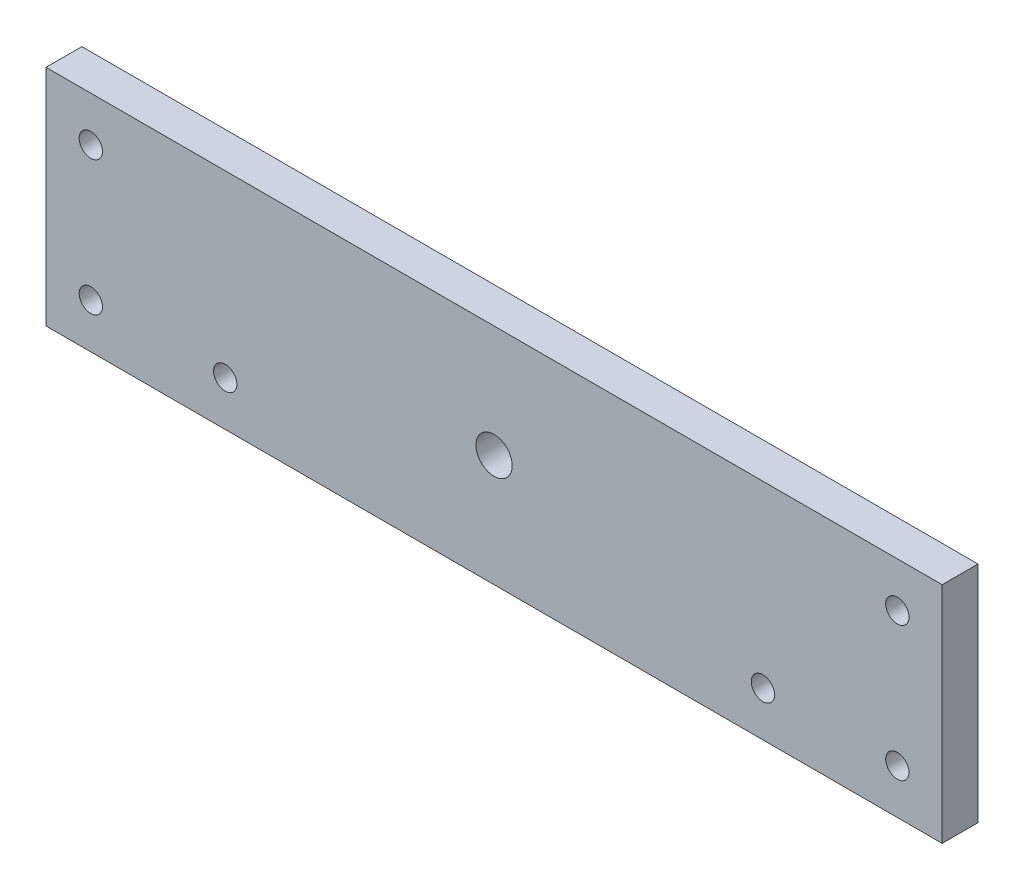
ISO-10303-21;
HEADER;
FILE_DESCRIPTION(('STEP AP214'),'2;1');
FILE_NAME('part.step','',(''),(''),'','','');
FILE_SCHEMA(('AUTOMOTIVE_DESIGN { 1 0 10303 214 1 1 1 1 }'));
ENDSEC;
DATA;
#1=APPLICATION_CONTEXT('core data for automotive mechanical design processes');
#2=APPLICATION_PROTOCOL_DEFINITION('international standard','automotive_design',2000,#1);
#3=PRODUCT_CONTEXT('',#1,'mechanical');
#4=PRODUCT('Part','Part','',(#3));
#5=PRODUCT_RELATED_PRODUCT_CATEGORY('part','',(#4));
#6=PRODUCT_DEFINITION_FORMATION('','',#4);
#7=PRODUCT_DEFINITION_CONTEXT('part definition',#1,'design');
#8=PRODUCT_DEFINITION('design','',#6,#7);
#9=PRODUCT_DEFINITION_SHAPE('','',#8);
#10=(LENGTH_UNIT() NAMED_UNIT(*) SI_UNIT(.MILLI.,.METRE.));
#11=(NAMED_UNIT(*) PLANE_ANGLE_UNIT() SI_UNIT($,.RADIAN.));
#12=(NAMED_UNIT(*) SI_UNIT($,.STERADIAN.) SOLID_ANGLE_UNIT());
#13=UNCERTAINTY_MEASURE_WITH_UNIT(LENGTH_MEASURE(1.E-05),#10,'distance_accuracy_value','');
#14=(GEOMETRIC_REPRESENTATION_CONTEXT(3) GLOBAL_UNCERTAINTY_ASSIGNED_CONTEXT((#13)) GLOBAL_UNIT_ASSIGNED_CONTEXT((#10,
#11,#12)) REPRESENTATION_CONTEXT('',''));
#15=CARTESIAN_POINT('',(0.,0.,0.));
#16=DIRECTION('',(0.,0.,1.));
#17=DIRECTION('',(1.,0.,0.));
#18=AXIS2_PLACEMENT_3D('',#15,#16,#17);
#19=CARTESIAN_POINT('',(-88.1445904954499,-0.815217391304357,8.));
#20=DIRECTION('',(0.,1.,0.));
#21=DIRECTION('',(0.,0.,1.));
#22=AXIS2_PLACEMENT_3D('',#19,#20,#21);
#23=PLANE('',#22);
#24=DIRECTION('',(1.,0.,0.));
#25=VECTOR('',#24,1.);
#26=CARTESIAN_POINT('',(-88.1445904954499,-0.815217391304357,0.));
#27=LINE('',#26,#25);
#28=CARTESIAN_POINT('',(-88.1445904954499,-0.815217391304357,0.));
#29=VERTEX_POINT('',#28);
#30=CARTESIAN_POINT('',(111.85540950455,-0.815217391304357,0.));
#31=VERTEX_POINT('',#30);
#32=EDGE_CURVE('E105',#29,#31,#27,.T.);
#33=ORIENTED_EDGE('',*,*,#32,.T.);
#34=DIRECTION('',(0.,0.,-1.));
#35=VECTOR('',#34,1.);
#36=CARTESIAN_POINT('',(111.85540950455,-0.815217391304357,8.));
#37=LINE('',#36,#35);
#38=CARTESIAN_POINT('',(111.85540950455,-0.815217391304357,8.));
#39=VERTEX_POINT('',#38);
#40=EDGE_CURVE('E11',#39,#31,#37,.T.);
#41=ORIENTED_EDGE('',*,*,#40,.F.);
#42=DIRECTION('',(1.,0.,0.));
#43=VECTOR('',#42,1.);
#44=CARTESIAN_POINT('',(-88.1445904954499,-0.815217391304357,8.));
#45=LINE('',#44,#43);
#46=CARTESIAN_POINT('',(-88.1445904954499,-0.815217391304357,8.));
#47=VERTEX_POINT('',#46);
#48=EDGE_CURVE('E78',#47,#39,#45,.T.);
#49=ORIENTED_EDGE('',*,*,#48,.F.);
#50=DIRECTION('',(0.,0.,-1.));
#51=VECTOR('',#50,1.);
#52=CARTESIAN_POINT('',(-88.1445904954499,-0.815217391304357,8.));
#53=LINE('',#52,#51);
#54=EDGE_CURVE('E101',#47,#29,#53,.T.);
#55=ORIENTED_EDGE('',*,*,#54,.T.);
#56=EDGE_LOOP('',(#33,#41,#49,#55));
#57=FACE_BOUND('',#56,.T.);
#58=ADVANCED_FACE('F38',(#57),#23,.F.);
#59=CARTESIAN_POINT('',(111.85540950455,49.1847826086956,8.));
#60=DIRECTION('',(1.,0.,0.));
#61=DIRECTION('',(0.,1.,0.));
#62=AXIS2_PLACEMENT_3D('',#59,#60,#61);
#63=PLANE('',#62);
#64=DIRECTION('',(0.,-1.,0.));
#65=VECTOR('',#64,1.);
#66=CARTESIAN_POINT('',(111.85540950455,49.1847826086956,0.));
#67=LINE('',#66,#65);
#68=CARTESIAN_POINT('',(111.85540950455,49.1847826086956,0.));
#69=VERTEX_POINT('',#68);
#70=EDGE_CURVE('E87',#69,#31,#67,.T.);
#71=ORIENTED_EDGE('',*,*,#70,.F.);
#72=DIRECTION('',(0.,0.,-1.));
#73=VECTOR('',#72,1.);
#74=CARTESIAN_POINT('',(111.85540950455,49.1847826086956,8.));
#75=LINE('',#74,#73);
#76=CARTESIAN_POINT('',(111.85540950455,49.1847826086956,8.));
#77=VERTEX_POINT('',#76);
#78=EDGE_CURVE('E47',#77,#69,#75,.T.);
#79=ORIENTED_EDGE('',*,*,#78,.F.);
#80=DIRECTION('',(0.,-1.,0.));
#81=VECTOR('',#80,1.);
#82=CARTESIAN_POINT('',(111.85540950455,49.1847826086956,8.));
#83=LINE('',#82,#81);
#84=EDGE_CURVE('E85',#77,#39,#83,.T.);
#85=ORIENTED_EDGE('',*,*,#84,.T.);
#86=ORIENTED_EDGE('',*,*,#40,.T.);
#87=EDGE_LOOP('',(#71,#79,#85,#86));
#88=FACE_BOUND('',#87,.T.);
#89=ADVANCED_FACE('F84',(#88),#63,.T.);
#90=CARTESIAN_POINT('',(-88.1445904954499,49.1847826086956,8.));
#91=DIRECTION('',(0.,1.,0.));
#92=DIRECTION('',(0.,0.,1.));
#93=AXIS2_PLACEMENT_3D('',#90,#91,#92);
#94=PLANE('',#93);
#95=DIRECTION('',(1.,0.,0.));
#96=VECTOR('',#95,1.);
#97=CARTESIAN_POINT('',(-88.1445904954499,49.1847826086956,0.));
#98=LINE('',#97,#96);
#99=CARTESIAN_POINT('',(-88.1445904954499,49.1847826086956,0.));
#100=VERTEX_POINT('',#99);
#101=EDGE_CURVE('E112',#100,#69,#98,.T.);
#102=ORIENTED_EDGE('',*,*,#101,.F.);
#103=DIRECTION('',(0.,0.,-1.));
#104=VECTOR('',#103,1.);
#105=CARTESIAN_POINT('',(-88.1445904954499,49.1847826086956,8.));
#106=LINE('',#105,#104);
#107=CARTESIAN_POINT('',(-88.1445904954499,49.1847826086956,8.));
#108=VERTEX_POINT('',#107);
#109=EDGE_CURVE('E70',#108,#100,#106,.T.);
#110=ORIENTED_EDGE('',*,*,#109,.F.);
#111=DIRECTION('',(1.,0.,0.));
#112=VECTOR('',#111,1.);
#113=CARTESIAN_POINT('',(-88.1445904954499,49.1847826086956,8.));
#114=LINE('',#113,#112);
#115=EDGE_CURVE('E94',#108,#77,#114,.T.);
#116=ORIENTED_EDGE('',*,*,#115,.T.);
#117=ORIENTED_EDGE('',*,*,#78,.T.);
#118=EDGE_LOOP('',(#102,#110,#116,#117));
#119=FACE_BOUND('',#118,.T.);
#120=ADVANCED_FACE('F97',(#119),#94,.T.);
#121=CARTESIAN_POINT('',(-88.1445904954499,49.1847826086956,8.));
#122=DIRECTION('',(1.,0.,0.));
#123=DIRECTION('',(0.,0.,-1.));
#124=AXIS2_PLACEMENT_3D('',#121,#122,#123);
#125=PLANE('',#124);
#126=DIRECTION('',(0.,-1.,0.));
#127=VECTOR('',#126,1.);
#128=CARTESIAN_POINT('',(-88.1445904954499,49.1847826086956,0.));
#129=LINE('',#128,#127);
#130=EDGE_CURVE('E73',#100,#29,#129,.T.);
#131=ORIENTED_EDGE('',*,*,#130,.T.);
#132=ORIENTED_EDGE('',*,*,#54,.F.);
#133=DIRECTION('',(0.,-1.,0.));
#134=VECTOR('',#133,1.);
#135=CARTESIAN_POINT('',(-88.1445904954499,49.1847826086956,8.));
#136=LINE('',#135,#134);
#137=EDGE_CURVE('E55',#108,#47,#136,.T.);
#138=ORIENTED_EDGE('',*,*,#137,.F.);
#139=ORIENTED_EDGE('',*,*,#109,.T.);
#140=EDGE_LOOP('',(#131,#132,#138,#139));
#141=FACE_BOUND('',#140,.T.);
#142=ADVANCED_FACE('F136',(#141),#125,.F.);
#143=CARTESIAN_POINT('',(0.,0.,8.));
#144=DIRECTION('',(0.,0.,-1.));
#145=DIRECTION('',(-1.,0.,0.));
#146=AXIS2_PLACEMENT_3D('',#143,#144,#145);
#147=PLANE('',#146);
#148=CARTESIAN_POINT('',(11.8554095045501,24.1847826086956,8.));
#149=DIRECTION('',(0.,0.,-1.));
#150=DIRECTION('',(-1.,0.,0.));
#151=AXIS2_PLACEMENT_3D('',#148,#149,#150);
#152=CIRCLE('',#151,4.05);
#153=CARTESIAN_POINT('',(7.80540950455011,24.1847826086956,8.));
#154=VERTEX_POINT('',#153);
#155=EDGE_CURVE('E236',#154,#154,#152,.T.);
#156=ORIENTED_EDGE('',*,*,#155,.T.);
#157=EDGE_LOOP('',(#156));
#158=FACE_BOUND('',#157,.T.);
#159=CARTESIAN_POINT('',(71.8554095045501,9.18478260869565,8.));
#160=DIRECTION('',(0.,0.,-1.));
#161=DIRECTION('',(-1.,0.,0.));
#162=AXIS2_PLACEMENT_3D('',#159,#160,#161);
#163=CIRCLE('',#162,2.6);
#164=CARTESIAN_POINT('',(69.2554095045501,9.18478260869565,8.));
#165=VERTEX_POINT('',#164);
#166=EDGE_CURVE('E243',#165,#165,#163,.T.);
#167=ORIENTED_EDGE('',*,*,#166,.T.);
#168=EDGE_LOOP('',(#167));
#169=FACE_BOUND('',#168,.T.);
#170=CARTESIAN_POINT('',(-48.1445904954499,9.18478260869565,8.));
#171=DIRECTION('',(0.,0.,-1.));
#172=DIRECTION('',(-1.,0.,0.));
#173=AXIS2_PLACEMENT_3D('',#170,#171,#172);
#174=CIRCLE('',#173,2.59999999999999);
#175=CARTESIAN_POINT('',(-50.7445904954499,9.18478260869565,8.));
#176=VERTEX_POINT('',#175);
#177=EDGE_CURVE('E254',#176,#176,#174,.T.);
#178=ORIENTED_EDGE('',*,*,#177,.T.);
#179=EDGE_LOOP('',(#178));
#180=FACE_BOUND('',#179,.T.);
#181=CARTESIAN_POINT('',(101.85540950455,39.1847826086956,8.));
#182=DIRECTION('',(0.,0.,-1.));
#183=DIRECTION('',(-1.,0.,0.));
#184=AXIS2_PLACEMENT_3D('',#181,#182,#183);
#185=CIRCLE('',#184,2.6);
#186=CARTESIAN_POINT('',(99.2554095045501,39.1847826086956,8.));
#187=VERTEX_POINT('',#186);
#188=EDGE_CURVE('E262',#187,#187,#185,.T.);
#189=ORIENTED_EDGE('',*,*,#188,.T.);
#190=EDGE_LOOP('',(#189));
#191=FACE_BOUND('',#190,.T.);
#192=CARTESIAN_POINT('',(101.85540950455,9.18478260869565,8.));
#193=DIRECTION('',(0.,0.,-1.));
#194=DIRECTION('',(-1.,0.,0.));
#195=AXIS2_PLACEMENT_3D('',#192,#193,#194);
#196=CIRCLE('',#195,2.6);
#197=CARTESIAN_POINT('',(99.2554095045504,9.18478260869565,8.));
#198=VERTEX_POINT('',#197);
#199=EDGE_CURVE('E270',#198,#198,#196,.T.);
#200=ORIENTED_EDGE('',*,*,#199,.T.);
#201=EDGE_LOOP('',(#200));
#202=FACE_BOUND('',#201,.T.);
#203=CARTESIAN_POINT('',(-78.1445904954496,9.18478260869565,8.));
#204=DIRECTION('',(0.,0.,-1.));
#205=DIRECTION('',(-1.,0.,0.));
#206=AXIS2_PLACEMENT_3D('',#203,#204,#205);
#207=CIRCLE('',#206,2.6);
#208=CARTESIAN_POINT('',(-80.7445904954496,9.18478260869565,8.));
#209=VERTEX_POINT('',#208);
#210=EDGE_CURVE('E278',#209,#209,#207,.T.);
#211=ORIENTED_EDGE('',*,*,#210,.T.);
#212=EDGE_LOOP('',(#211));
#213=FACE_BOUND('',#212,.T.);
#214=CARTESIAN_POINT('',(-78.1445904954499,39.1847826086956,8.));
#215=DIRECTION('',(0.,0.,-1.));
#216=DIRECTION('',(-1.,0.,0.));
#217=AXIS2_PLACEMENT_3D('',#214,#215,#216);
#218=CIRCLE('',#217,2.6);
#219=CARTESIAN_POINT('',(-80.7445904954499,39.1847826086956,8.));
#220=VERTEX_POINT('',#219);
#221=EDGE_CURVE('E109',#220,#220,#218,.T.);
#222=ORIENTED_EDGE('',*,*,#221,.T.);
#223=EDGE_LOOP('',(#222));
#224=FACE_BOUND('',#223,.T.);
#225=ORIENTED_EDGE('',*,*,#48,.T.);
#226=ORIENTED_EDGE('',*,*,#84,.F.);
#227=ORIENTED_EDGE('',*,*,#115,.F.);
#228=ORIENTED_EDGE('',*,*,#137,.T.);
#229=EDGE_LOOP('',(#225,#226,#227,#228));
#230=FACE_BOUND('',#229,.T.);
#231=ADVANCED_FACE('F93',(#158,#169,#180,#191,#202,#213,#224,#230),#147,.F.);
#232=CARTESIAN_POINT('',(0.,0.,0.));
#233=DIRECTION('',(0.,0.,-1.));
#234=DIRECTION('',(-1.,0.,0.));
#235=AXIS2_PLACEMENT_3D('',#232,#233,#234);
#236=PLANE('',#235);
#237=CARTESIAN_POINT('',(11.8554095045501,24.1847826086956,0.));
#238=DIRECTION('',(0.,0.,-1.));
#239=DIRECTION('',(-1.,0.,0.));
#240=AXIS2_PLACEMENT_3D('',#237,#238,#239);
#241=CIRCLE('',#240,4.05);
#242=CARTESIAN_POINT('',(7.80540950455011,24.1847826086956,0.));
#243=VERTEX_POINT('',#242);
#244=EDGE_CURVE('E233',#243,#243,#241,.T.);
#245=ORIENTED_EDGE('',*,*,#244,.F.);
#246=EDGE_LOOP('',(#245));
#247=FACE_BOUND('',#246,.T.);
#248=CARTESIAN_POINT('',(71.8554095045501,9.18478260869565,0.));
#249=DIRECTION('',(0.,0.,-1.));
#250=DIRECTION('',(-1.,0.,0.));
#251=AXIS2_PLACEMENT_3D('',#248,#249,#250);
#252=CIRCLE('',#251,2.59999999999999);
#253=CARTESIAN_POINT('',(69.2554095045501,9.18478260869565,0.));
#254=VERTEX_POINT('',#253);
#255=EDGE_CURVE('E238',#254,#254,#252,.T.);
#256=ORIENTED_EDGE('',*,*,#255,.F.);
#257=EDGE_LOOP('',(#256));
#258=FACE_BOUND('',#257,.T.);
#259=CARTESIAN_POINT('',(-48.1445904954499,9.18478260869565,0.));
#260=DIRECTION('',(0.,0.,-1.));
#261=DIRECTION('',(-1.,0.,0.));
#262=AXIS2_PLACEMENT_3D('',#259,#260,#261);
#263=CIRCLE('',#262,2.59999999999998);
#264=CARTESIAN_POINT('',(-50.7445904954499,9.18478260869565,0.));
#265=VERTEX_POINT('',#264);
#266=EDGE_CURVE('E250',#265,#265,#263,.T.);
#267=ORIENTED_EDGE('',*,*,#266,.F.);
#268=EDGE_LOOP('',(#267));
#269=FACE_BOUND('',#268,.T.);
#270=CARTESIAN_POINT('',(101.85540950455,39.1847826086956,0.));
#271=DIRECTION('',(0.,0.,-1.));
#272=DIRECTION('',(-1.,0.,0.));
#273=AXIS2_PLACEMENT_3D('',#270,#271,#272);
#274=CIRCLE('',#273,2.59999999999999);
#275=CARTESIAN_POINT('',(99.2554095045501,39.1847826086956,0.));
#276=VERTEX_POINT('',#275);
#277=EDGE_CURVE('E258',#276,#276,#274,.T.);
#278=ORIENTED_EDGE('',*,*,#277,.F.);
#279=EDGE_LOOP('',(#278));
#280=FACE_BOUND('',#279,.T.);
#281=CARTESIAN_POINT('',(101.85540950455,9.18478260869565,0.));
#282=DIRECTION('',(0.,0.,-1.));
#283=DIRECTION('',(-1.,0.,0.));
#284=AXIS2_PLACEMENT_3D('',#281,#282,#283);
#285=CIRCLE('',#284,2.59999999999999);
#286=CARTESIAN_POINT('',(99.2554095045504,9.18478260869565,0.));
#287=VERTEX_POINT('',#286);
#288=EDGE_CURVE('E266',#287,#287,#285,.T.);
#289=ORIENTED_EDGE('',*,*,#288,.F.);
#290=EDGE_LOOP('',(#289));
#291=FACE_BOUND('',#290,.T.);
#292=CARTESIAN_POINT('',(-78.1445904954496,9.18478260869565,0.));
#293=DIRECTION('',(0.,0.,-1.));
#294=DIRECTION('',(-1.,0.,0.));
#295=AXIS2_PLACEMENT_3D('',#292,#293,#294);
#296=CIRCLE('',#295,2.59999999999999);
#297=CARTESIAN_POINT('',(-80.7445904954496,9.18478260869565,0.));
#298=VERTEX_POINT('',#297);
#299=EDGE_CURVE('E274',#298,#298,#296,.T.);
#300=ORIENTED_EDGE('',*,*,#299,.F.);
#301=EDGE_LOOP('',(#300));
#302=FACE_BOUND('',#301,.T.);
#303=CARTESIAN_POINT('',(-78.1445904954499,39.1847826086956,0.));
#304=DIRECTION('',(0.,0.,-1.));
#305=DIRECTION('',(-1.,0.,0.));
#306=AXIS2_PLACEMENT_3D('',#303,#304,#305);
#307=CIRCLE('',#306,2.59999999999999);
#308=CARTESIAN_POINT('',(-80.7445904954499,39.1847826086956,0.));
#309=VERTEX_POINT('',#308);
#310=EDGE_CURVE('E282',#309,#309,#307,.T.);
#311=ORIENTED_EDGE('',*,*,#310,.F.);
#312=EDGE_LOOP('',(#311));
#313=FACE_BOUND('',#312,.T.);
#314=ORIENTED_EDGE('',*,*,#32,.F.);
#315=ORIENTED_EDGE('',*,*,#130,.F.);
#316=ORIENTED_EDGE('',*,*,#101,.T.);
#317=ORIENTED_EDGE('',*,*,#70,.T.);
#318=EDGE_LOOP('',(#314,#315,#316,#317));
#319=FACE_BOUND('',#318,.T.);
#320=ADVANCED_FACE('F123',(#247,#258,#269,#280,#291,#302,#313,#319),#236,.T.);
#321=CARTESIAN_POINT('',(-78.1445904954499,39.1847826086956,0.));
#322=DIRECTION('',(0.,0.,-1.));
#323=DIRECTION('',(-1.,0.,0.));
#324=AXIS2_PLACEMENT_3D('',#321,#322,#323);
#325=CYLINDRICAL_SURFACE('',#324,2.6);
#326=ORIENTED_EDGE('',*,*,#221,.F.);
#327=EDGE_LOOP('',(#326));
#328=FACE_BOUND('',#327,.T.);
#329=ORIENTED_EDGE('',*,*,#310,.T.);
#330=EDGE_LOOP('',(#329));
#331=FACE_BOUND('',#330,.T.);
#332=ADVANCED_FACE('F125',(#328,#331),#325,.F.);
#333=CARTESIAN_POINT('',(-78.1445904954496,9.18478260869565,0.));
#334=DIRECTION('',(0.,0.,-1.));
#335=DIRECTION('',(-1.,0.,0.));
#336=AXIS2_PLACEMENT_3D('',#333,#334,#335);
#337=CYLINDRICAL_SURFACE('',#336,2.6);
#338=ORIENTED_EDGE('',*,*,#210,.F.);
#339=EDGE_LOOP('',(#338));
#340=FACE_BOUND('',#339,.T.);
#341=ORIENTED_EDGE('',*,*,#299,.T.);
#342=EDGE_LOOP('',(#341));
#343=FACE_BOUND('',#342,.T.);
#344=ADVANCED_FACE('F133',(#340,#343),#337,.F.);
#345=CARTESIAN_POINT('',(101.85540950455,9.18478260869565,0.));
#346=DIRECTION('',(0.,0.,-1.));
#347=DIRECTION('',(-1.,0.,0.));
#348=AXIS2_PLACEMENT_3D('',#345,#346,#347);
#349=CYLINDRICAL_SURFACE('',#348,2.6);
#350=ORIENTED_EDGE('',*,*,#199,.F.);
#351=EDGE_LOOP('',(#350));
#352=FACE_BOUND('',#351,.T.);
#353=ORIENTED_EDGE('',*,*,#288,.T.);
#354=EDGE_LOOP('',(#353));
#355=FACE_BOUND('',#354,.T.);
#356=ADVANCED_FACE('F176',(#352,#355),#349,.F.);
#357=CARTESIAN_POINT('',(101.85540950455,39.1847826086956,0.));
#358=DIRECTION('',(0.,0.,-1.));
#359=DIRECTION('',(-1.,0.,0.));
#360=AXIS2_PLACEMENT_3D('',#357,#358,#359);
#361=CYLINDRICAL_SURFACE('',#360,2.6);
#362=ORIENTED_EDGE('',*,*,#188,.F.);
#363=EDGE_LOOP('',(#362));
#364=FACE_BOUND('',#363,.T.);
#365=ORIENTED_EDGE('',*,*,#277,.T.);
#366=EDGE_LOOP('',(#365));
#367=FACE_BOUND('',#366,.T.);
#368=ADVANCED_FACE('F184',(#364,#367),#361,.F.);
#369=CARTESIAN_POINT('',(-48.1445904954499,9.18478260869565,0.));
#370=DIRECTION('',(0.,0.,-1.));
#371=DIRECTION('',(-1.,0.,0.));
#372=AXIS2_PLACEMENT_3D('',#369,#370,#371);
#373=CYLINDRICAL_SURFACE('',#372,2.59999999999999);
#374=ORIENTED_EDGE('',*,*,#177,.F.);
#375=EDGE_LOOP('',(#374));
#376=FACE_BOUND('',#375,.T.);
#377=ORIENTED_EDGE('',*,*,#266,.T.);
#378=EDGE_LOOP('',(#377));
#379=FACE_BOUND('',#378,.T.);
#380=ADVANCED_FACE('F192',(#376,#379),#373,.F.);
#381=CARTESIAN_POINT('',(71.8554095045501,9.18478260869565,0.));
#382=DIRECTION('',(0.,0.,-1.));
#383=DIRECTION('',(-1.,0.,0.));
#384=AXIS2_PLACEMENT_3D('',#381,#382,#383);
#385=CYLINDRICAL_SURFACE('',#384,2.6);
#386=ORIENTED_EDGE('',*,*,#166,.F.);
#387=EDGE_LOOP('',(#386));
#388=FACE_BOUND('',#387,.T.);
#389=ORIENTED_EDGE('',*,*,#255,.T.);
#390=EDGE_LOOP('',(#389));
#391=FACE_BOUND('',#390,.T.);
#392=ADVANCED_FACE('F200',(#388,#391),#385,.F.);
#393=CARTESIAN_POINT('',(11.8554095045501,24.1847826086956,10.));
#394=DIRECTION('',(0.,0.,-1.));
#395=DIRECTION('',(-1.,0.,0.));
#396=AXIS2_PLACEMENT_3D('',#393,#394,#395);
#397=CYLINDRICAL_SURFACE('',#396,4.05);
#398=ORIENTED_EDGE('',*,*,#244,.T.);
#399=EDGE_LOOP('',(#398));
#400=FACE_BOUND('',#399,.T.);
#401=ORIENTED_EDGE('',*,*,#155,.F.);
#402=EDGE_LOOP('',(#401));
#403=FACE_BOUND('',#402,.T.);
#404=ADVANCED_FACE('F207',(#400,#403),#397,.F.);
#405=CLOSED_SHELL('',(#58,#89,#120,#142,#231,#320,#332,#344,#356,#368,#380,#392,#404));
#406=MANIFOLD_SOLID_BREP('B2',#405);
#407=ADVANCED_BREP_SHAPE_REPRESENTATION('',(#18,#406),#14);
#408=SHAPE_DEFINITION_REPRESENTATION(#9,#407);
ENDSEC;
END-ISO-10303-21;
